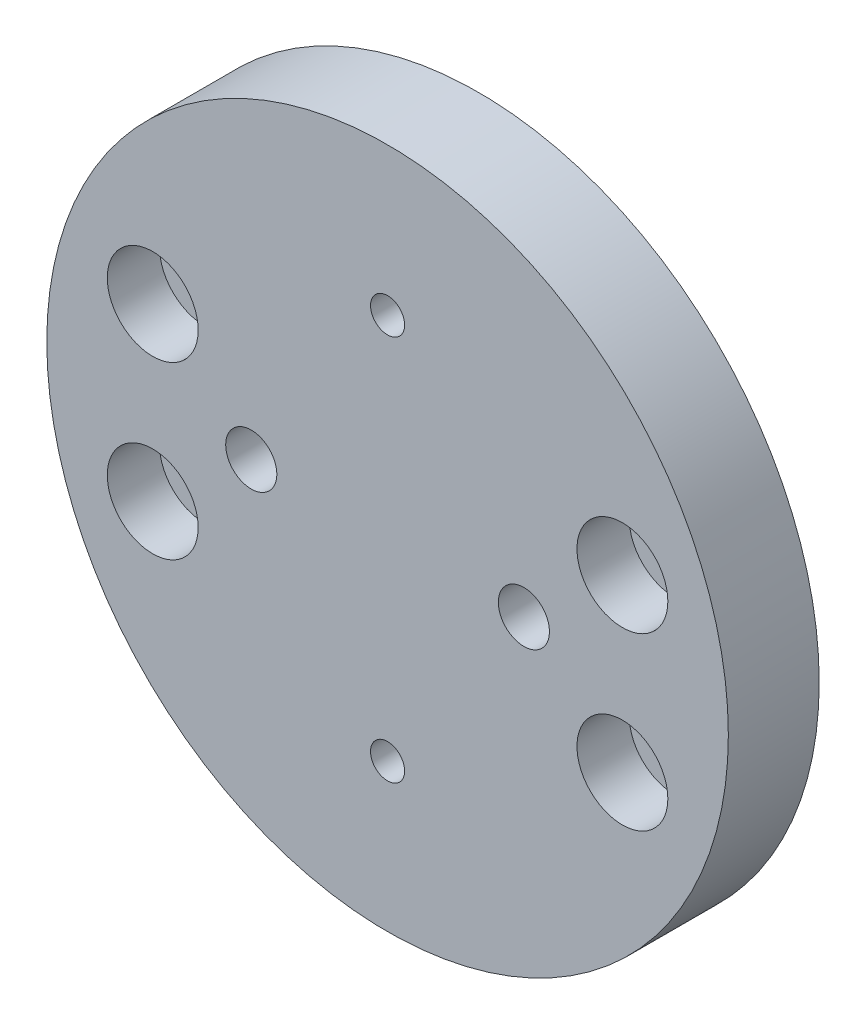
ISO-10303-21;
HEADER;
FILE_DESCRIPTION(('STEP AP214'),'2;1');
FILE_NAME('part.step','',(''),(''),'','','');
FILE_SCHEMA(('AUTOMOTIVE_DESIGN { 1 0 10303 214 1 1 1 1 }'));
ENDSEC;
DATA;
#1=APPLICATION_CONTEXT('core data for automotive mechanical design processes');
#2=APPLICATION_PROTOCOL_DEFINITION('international standard','automotive_design',2000,#1);
#3=PRODUCT_CONTEXT('',#1,'mechanical');
#4=PRODUCT('Part','Part','',(#3));
#5=PRODUCT_RELATED_PRODUCT_CATEGORY('part','',(#4));
#6=PRODUCT_DEFINITION_FORMATION('','',#4);
#7=PRODUCT_DEFINITION_CONTEXT('part definition',#1,'design');
#8=PRODUCT_DEFINITION('design','',#6,#7);
#9=PRODUCT_DEFINITION_SHAPE('','',#8);
#10=(LENGTH_UNIT() NAMED_UNIT(*) SI_UNIT(.MILLI.,.METRE.));
#11=(NAMED_UNIT(*) PLANE_ANGLE_UNIT() SI_UNIT($,.RADIAN.));
#12=(NAMED_UNIT(*) SI_UNIT($,.STERADIAN.) SOLID_ANGLE_UNIT());
#13=UNCERTAINTY_MEASURE_WITH_UNIT(LENGTH_MEASURE(1.E-05),#10,'distance_accuracy_value','');
#14=(GEOMETRIC_REPRESENTATION_CONTEXT(3) GLOBAL_UNCERTAINTY_ASSIGNED_CONTEXT((#13)) GLOBAL_UNIT_ASSIGNED_CONTEXT((#10,
#11,#12)) REPRESENTATION_CONTEXT('',''));
#15=CARTESIAN_POINT('',(0.,0.,0.));
#16=DIRECTION('',(0.,0.,1.));
#17=DIRECTION('',(1.,0.,0.));
#18=AXIS2_PLACEMENT_3D('',#15,#16,#17);
#19=CARTESIAN_POINT('',(0.,0.,8.));
#20=DIRECTION('',(0.,0.,-1.));
#21=DIRECTION('',(-1.,0.,0.));
#22=AXIS2_PLACEMENT_3D('',#19,#20,#21);
#23=CYLINDRICAL_SURFACE('',#22,30.);
#24=CARTESIAN_POINT('',(0.,0.,8.));
#25=DIRECTION('',(0.,0.,1.));
#26=DIRECTION('',(1.,0.,0.));
#27=AXIS2_PLACEMENT_3D('',#24,#25,#26);
#28=CIRCLE('',#27,30.);
#29=CARTESIAN_POINT('',(30.,0.,8.));
#30=VERTEX_POINT('',#29);
#31=EDGE_CURVE('E10',#30,#30,#28,.T.);
#32=ORIENTED_EDGE('',*,*,#31,.F.);
#33=EDGE_LOOP('',(#32));
#34=FACE_BOUND('',#33,.T.);
#35=CARTESIAN_POINT('',(0.,0.,0.));
#36=DIRECTION('',(0.,0.,1.));
#37=DIRECTION('',(1.,0.,0.));
#38=AXIS2_PLACEMENT_3D('',#35,#36,#37);
#39=CIRCLE('',#38,30.);
#40=CARTESIAN_POINT('',(30.,0.,0.));
#41=VERTEX_POINT('',#40);
#42=EDGE_CURVE('E36',#41,#41,#39,.T.);
#43=ORIENTED_EDGE('',*,*,#42,.T.);
#44=EDGE_LOOP('',(#43));
#45=FACE_BOUND('',#44,.T.);
#46=ADVANCED_FACE('F33',(#34,#45),#23,.T.);
#47=CARTESIAN_POINT('',(0.,0.,8.));
#48=DIRECTION('',(0.,0.,1.));
#49=DIRECTION('',(1.,0.,0.));
#50=AXIS2_PLACEMENT_3D('',#47,#48,#49);
#51=PLANE('',#50);
#52=CARTESIAN_POINT('',(-20.67323765729,7.52444315316473,8.));
#53=DIRECTION('',(0.,0.,1.));
#54=DIRECTION('',(1.,0.,0.));
#55=AXIS2_PLACEMENT_3D('',#52,#53,#54);
#56=CIRCLE('',#55,4.);
#57=CARTESIAN_POINT('',(-16.67323765729,7.52444315316473,8.));
#58=VERTEX_POINT('',#57);
#59=EDGE_CURVE('E131',#58,#58,#56,.T.);
#60=ORIENTED_EDGE('',*,*,#59,.F.);
#61=EDGE_LOOP('',(#60));
#62=FACE_BOUND('',#61,.T.);
#63=CARTESIAN_POINT('',(-20.67323765729,-7.52444315316473,8.));
#64=DIRECTION('',(0.,0.,1.));
#65=DIRECTION('',(1.,0.,0.));
#66=AXIS2_PLACEMENT_3D('',#63,#64,#65);
#67=CIRCLE('',#66,4.);
#68=CARTESIAN_POINT('',(-16.67323765729,-7.52444315316473,8.));
#69=VERTEX_POINT('',#68);
#70=EDGE_CURVE('E119',#69,#69,#67,.T.);
#71=ORIENTED_EDGE('',*,*,#70,.F.);
#72=EDGE_LOOP('',(#71));
#73=FACE_BOUND('',#72,.T.);
#74=CARTESIAN_POINT('',(20.67323765729,7.52444315316473,8.));
#75=DIRECTION('',(0.,0.,1.));
#76=DIRECTION('',(1.,0.,0.));
#77=AXIS2_PLACEMENT_3D('',#74,#75,#76);
#78=CIRCLE('',#77,4.);
#79=CARTESIAN_POINT('',(24.67323765729,7.52444315316473,8.));
#80=VERTEX_POINT('',#79);
#81=EDGE_CURVE('E107',#80,#80,#78,.T.);
#82=ORIENTED_EDGE('',*,*,#81,.F.);
#83=EDGE_LOOP('',(#82));
#84=FACE_BOUND('',#83,.T.);
#85=CARTESIAN_POINT('',(20.67323765729,-7.52444315316473,8.));
#86=DIRECTION('',(0.,0.,1.));
#87=DIRECTION('',(1.,0.,0.));
#88=AXIS2_PLACEMENT_3D('',#85,#86,#87);
#89=CIRCLE('',#88,4.);
#90=CARTESIAN_POINT('',(24.67323765729,-7.52444315316473,8.));
#91=VERTEX_POINT('',#90);
#92=EDGE_CURVE('E95',#91,#91,#89,.T.);
#93=ORIENTED_EDGE('',*,*,#92,.F.);
#94=EDGE_LOOP('',(#93));
#95=FACE_BOUND('',#94,.T.);
#96=CARTESIAN_POINT('',(0.,-17.,8.));
#97=DIRECTION('',(0.,0.,-1.));
#98=DIRECTION('',(-1.,0.,0.));
#99=AXIS2_PLACEMENT_3D('',#96,#97,#98);
#100=CIRCLE('',#99,1.5);
#101=CARTESIAN_POINT('',(-1.5,-17.,8.));
#102=VERTEX_POINT('',#101);
#103=EDGE_CURVE('E80',#102,#102,#100,.T.);
#104=ORIENTED_EDGE('',*,*,#103,.T.);
#105=EDGE_LOOP('',(#104));
#106=FACE_BOUND('',#105,.T.);
#107=CARTESIAN_POINT('',(0.,17.,8.));
#108=DIRECTION('',(0.,0.,-1.));
#109=DIRECTION('',(-1.,0.,0.));
#110=AXIS2_PLACEMENT_3D('',#107,#108,#109);
#111=CIRCLE('',#110,1.5);
#112=CARTESIAN_POINT('',(-1.5,17.,8.));
#113=VERTEX_POINT('',#112);
#114=EDGE_CURVE('E74',#113,#113,#111,.T.);
#115=ORIENTED_EDGE('',*,*,#114,.T.);
#116=EDGE_LOOP('',(#115));
#117=FACE_BOUND('',#116,.T.);
#118=CARTESIAN_POINT('',(12.,0.,8.));
#119=DIRECTION('',(0.,0.,-1.));
#120=DIRECTION('',(-1.,0.,0.));
#121=AXIS2_PLACEMENT_3D('',#118,#119,#120);
#122=CIRCLE('',#121,2.25);
#123=CARTESIAN_POINT('',(9.75,0.,8.));
#124=VERTEX_POINT('',#123);
#125=EDGE_CURVE('E59',#124,#124,#122,.T.);
#126=ORIENTED_EDGE('',*,*,#125,.T.);
#127=EDGE_LOOP('',(#126));
#128=FACE_BOUND('',#127,.T.);
#129=CARTESIAN_POINT('',(-12.,0.,8.));
#130=DIRECTION('',(0.,0.,-1.));
#131=DIRECTION('',(-1.,0.,0.));
#132=AXIS2_PLACEMENT_3D('',#129,#130,#131);
#133=CIRCLE('',#132,2.25);
#134=CARTESIAN_POINT('',(-14.25,0.,8.));
#135=VERTEX_POINT('',#134);
#136=EDGE_CURVE('E43',#135,#135,#133,.T.);
#137=ORIENTED_EDGE('',*,*,#136,.T.);
#138=EDGE_LOOP('',(#137));
#139=FACE_BOUND('',#138,.T.);
#140=ORIENTED_EDGE('',*,*,#31,.T.);
#141=EDGE_LOOP('',(#140));
#142=FACE_BOUND('',#141,.T.);
#143=ADVANCED_FACE('F137',(#62,#73,#84,#95,#106,#117,#128,#139,#142),#51,.T.);
#144=CARTESIAN_POINT('',(0.,0.,0.));
#145=DIRECTION('',(0.,0.,1.));
#146=DIRECTION('',(1.,0.,0.));
#147=AXIS2_PLACEMENT_3D('',#144,#145,#146);
#148=PLANE('',#147);
#149=CARTESIAN_POINT('',(-20.67323765729,7.52444315316473,0.));
#150=DIRECTION('',(0.,0.,1.));
#151=DIRECTION('',(1.,0.,0.));
#152=AXIS2_PLACEMENT_3D('',#149,#150,#151);
#153=CIRCLE('',#152,2.25);
#154=CARTESIAN_POINT('',(-18.42323765729,7.52444315316473,0.));
#155=VERTEX_POINT('',#154);
#156=EDGE_CURVE('E122',#155,#155,#153,.T.);
#157=ORIENTED_EDGE('',*,*,#156,.T.);
#158=EDGE_LOOP('',(#157));
#159=FACE_BOUND('',#158,.T.);
#160=CARTESIAN_POINT('',(-20.67323765729,-7.52444315316473,0.));
#161=DIRECTION('',(0.,0.,1.));
#162=DIRECTION('',(1.,0.,0.));
#163=AXIS2_PLACEMENT_3D('',#160,#161,#162);
#164=CIRCLE('',#163,2.25);
#165=CARTESIAN_POINT('',(-18.42323765729,-7.52444315316473,0.));
#166=VERTEX_POINT('',#165);
#167=EDGE_CURVE('E110',#166,#166,#164,.T.);
#168=ORIENTED_EDGE('',*,*,#167,.T.);
#169=EDGE_LOOP('',(#168));
#170=FACE_BOUND('',#169,.T.);
#171=CARTESIAN_POINT('',(20.67323765729,7.52444315316473,0.));
#172=DIRECTION('',(0.,0.,1.));
#173=DIRECTION('',(1.,0.,0.));
#174=AXIS2_PLACEMENT_3D('',#171,#172,#173);
#175=CIRCLE('',#174,2.25);
#176=CARTESIAN_POINT('',(22.92323765729,7.52444315316473,0.));
#177=VERTEX_POINT('',#176);
#178=EDGE_CURVE('E98',#177,#177,#175,.T.);
#179=ORIENTED_EDGE('',*,*,#178,.T.);
#180=EDGE_LOOP('',(#179));
#181=FACE_BOUND('',#180,.T.);
#182=CARTESIAN_POINT('',(20.67323765729,-7.52444315316473,0.));
#183=DIRECTION('',(0.,0.,1.));
#184=DIRECTION('',(1.,0.,0.));
#185=AXIS2_PLACEMENT_3D('',#182,#183,#184);
#186=CIRCLE('',#185,2.25);
#187=CARTESIAN_POINT('',(22.92323765729,-7.52444315316473,0.));
#188=VERTEX_POINT('',#187);
#189=EDGE_CURVE('E86',#188,#188,#186,.T.);
#190=ORIENTED_EDGE('',*,*,#189,.T.);
#191=EDGE_LOOP('',(#190));
#192=FACE_BOUND('',#191,.T.);
#193=CARTESIAN_POINT('',(0.,-17.,0.));
#194=DIRECTION('',(0.,0.,-1.));
#195=DIRECTION('',(-1.,0.,0.));
#196=AXIS2_PLACEMENT_3D('',#193,#194,#195);
#197=CIRCLE('',#196,1.49999999999999);
#198=CARTESIAN_POINT('',(-1.49999999999999,-17.,0.));
#199=VERTEX_POINT('',#198);
#200=EDGE_CURVE('E83',#199,#199,#197,.T.);
#201=ORIENTED_EDGE('',*,*,#200,.F.);
#202=EDGE_LOOP('',(#201));
#203=FACE_BOUND('',#202,.T.);
#204=CARTESIAN_POINT('',(0.,17.,0.));
#205=DIRECTION('',(0.,0.,-1.));
#206=DIRECTION('',(-1.,0.,0.));
#207=AXIS2_PLACEMENT_3D('',#204,#205,#206);
#208=CIRCLE('',#207,1.49999999999999);
#209=CARTESIAN_POINT('',(-1.49999999999999,17.,0.));
#210=VERTEX_POINT('',#209);
#211=EDGE_CURVE('E77',#210,#210,#208,.T.);
#212=ORIENTED_EDGE('',*,*,#211,.F.);
#213=EDGE_LOOP('',(#212));
#214=FACE_BOUND('',#213,.T.);
#215=CARTESIAN_POINT('',(12.,0.,0.));
#216=DIRECTION('',(0.,0.,-1.));
#217=DIRECTION('',(-1.,0.,0.));
#218=AXIS2_PLACEMENT_3D('',#215,#216,#217);
#219=CIRCLE('',#218,4.025);
#220=CARTESIAN_POINT('',(7.975,0.,0.));
#221=VERTEX_POINT('',#220);
#222=EDGE_CURVE('E71',#221,#221,#219,.T.);
#223=ORIENTED_EDGE('',*,*,#222,.F.);
#224=EDGE_LOOP('',(#223));
#225=FACE_BOUND('',#224,.T.);
#226=CARTESIAN_POINT('',(-12.,0.,0.));
#227=DIRECTION('',(0.,0.,-1.));
#228=DIRECTION('',(-1.,0.,0.));
#229=AXIS2_PLACEMENT_3D('',#226,#227,#228);
#230=CIRCLE('',#229,4.025);
#231=CARTESIAN_POINT('',(-16.025,0.,0.));
#232=VERTEX_POINT('',#231);
#233=EDGE_CURVE('E56',#232,#232,#230,.T.);
#234=ORIENTED_EDGE('',*,*,#233,.F.);
#235=EDGE_LOOP('',(#234));
#236=FACE_BOUND('',#235,.T.);
#237=ORIENTED_EDGE('',*,*,#42,.F.);
#238=EDGE_LOOP('',(#237));
#239=FACE_BOUND('',#238,.T.);
#240=ADVANCED_FACE('F140',(#159,#170,#181,#192,#203,#214,#225,#236,#239),#148,.F.);
#241=CARTESIAN_POINT('',(-12.,0.,0.));
#242=DIRECTION('',(0.,0.,-1.));
#243=DIRECTION('',(-1.,0.,0.));
#244=AXIS2_PLACEMENT_3D('',#241,#242,#243);
#245=CYLINDRICAL_SURFACE('',#244,2.25);
#246=ORIENTED_EDGE('',*,*,#136,.F.);
#247=EDGE_LOOP('',(#246));
#248=FACE_BOUND('',#247,.T.);
#249=CARTESIAN_POINT('',(-12.,0.,4.6));
#250=DIRECTION('',(0.,0.,-1.));
#251=DIRECTION('',(-1.,0.,0.));
#252=AXIS2_PLACEMENT_3D('',#249,#250,#251);
#253=CIRCLE('',#252,2.25);
#254=CARTESIAN_POINT('',(-14.25,0.,4.6));
#255=VERTEX_POINT('',#254);
#256=EDGE_CURVE('E47',#255,#255,#253,.T.);
#257=ORIENTED_EDGE('',*,*,#256,.T.);
#258=EDGE_LOOP('',(#257));
#259=FACE_BOUND('',#258,.T.);
#260=ADVANCED_FACE('F156',(#248,#259),#245,.F.);
#261=CARTESIAN_POINT('',(-8.00000000000001,0.,4.6));
#262=DIRECTION('',(0.,0.,1.));
#263=DIRECTION('',(1.,0.,0.));
#264=AXIS2_PLACEMENT_3D('',#261,#262,#263);
#265=PLANE('',#264);
#266=ORIENTED_EDGE('',*,*,#256,.F.);
#267=EDGE_LOOP('',(#266));
#268=FACE_BOUND('',#267,.T.);
#269=CARTESIAN_POINT('',(-12.,0.,4.6));
#270=DIRECTION('',(0.,0.,-1.));
#271=DIRECTION('',(-1.,0.,0.));
#272=AXIS2_PLACEMENT_3D('',#269,#270,#271);
#273=CIRCLE('',#272,4.);
#274=CARTESIAN_POINT('',(-16.,0.,4.6));
#275=VERTEX_POINT('',#274);
#276=EDGE_CURVE('E50',#275,#275,#273,.T.);
#277=ORIENTED_EDGE('',*,*,#276,.T.);
#278=EDGE_LOOP('',(#277));
#279=FACE_BOUND('',#278,.T.);
#280=ADVANCED_FACE('F159',(#268,#279),#265,.F.);
#281=CARTESIAN_POINT('',(-12.,0.,0.));
#282=DIRECTION('',(0.,0.,-1.));
#283=DIRECTION('',(-1.,0.,0.));
#284=AXIS2_PLACEMENT_3D('',#281,#282,#283);
#285=CYLINDRICAL_SURFACE('',#284,4.);
#286=ORIENTED_EDGE('',*,*,#276,.F.);
#287=EDGE_LOOP('',(#286));
#288=FACE_BOUND('',#287,.T.);
#289=CARTESIAN_POINT('',(-12.,0.,0.0250000000000027));
#290=DIRECTION('',(0.,0.,-1.));
#291=DIRECTION('',(-1.,0.,0.));
#292=AXIS2_PLACEMENT_3D('',#289,#290,#291);
#293=CIRCLE('',#292,4.);
#294=CARTESIAN_POINT('',(-16.,0.,0.0250000000000027));
#295=VERTEX_POINT('',#294);
#296=EDGE_CURVE('E53',#295,#295,#293,.T.);
#297=ORIENTED_EDGE('',*,*,#296,.T.);
#298=EDGE_LOOP('',(#297));
#299=FACE_BOUND('',#298,.T.);
#300=ADVANCED_FACE('F165',(#288,#299),#285,.F.);
#301=CARTESIAN_POINT('',(-12.,0.,0.));
#302=DIRECTION('',(0.,0.,-1.));
#303=DIRECTION('',(-1.,0.,0.));
#304=AXIS2_PLACEMENT_3D('',#301,#302,#303);
#305=CONICAL_SURFACE('',#304,4.025,0.785398163397444);
#306=ORIENTED_EDGE('',*,*,#296,.F.);
#307=EDGE_LOOP('',(#306));
#308=FACE_BOUND('',#307,.T.);
#309=ORIENTED_EDGE('',*,*,#233,.T.);
#310=EDGE_LOOP('',(#309));
#311=FACE_BOUND('',#310,.T.);
#312=ADVANCED_FACE('F171',(#308,#311),#305,.F.);
#313=CARTESIAN_POINT('',(12.,0.,0.));
#314=DIRECTION('',(0.,0.,-1.));
#315=DIRECTION('',(-1.,0.,0.));
#316=AXIS2_PLACEMENT_3D('',#313,#314,#315);
#317=CYLINDRICAL_SURFACE('',#316,2.25);
#318=ORIENTED_EDGE('',*,*,#125,.F.);
#319=EDGE_LOOP('',(#318));
#320=FACE_BOUND('',#319,.T.);
#321=CARTESIAN_POINT('',(12.,0.,4.6));
#322=DIRECTION('',(0.,0.,-1.));
#323=DIRECTION('',(-1.,0.,0.));
#324=AXIS2_PLACEMENT_3D('',#321,#322,#323);
#325=CIRCLE('',#324,2.25);
#326=CARTESIAN_POINT('',(9.75,0.,4.6));
#327=VERTEX_POINT('',#326);
#328=EDGE_CURVE('E62',#327,#327,#325,.T.);
#329=ORIENTED_EDGE('',*,*,#328,.T.);
#330=EDGE_LOOP('',(#329));
#331=FACE_BOUND('',#330,.T.);
#332=ADVANCED_FACE('F177',(#320,#331),#317,.F.);
#333=CARTESIAN_POINT('',(16.,0.,4.6));
#334=DIRECTION('',(0.,0.,1.));
#335=DIRECTION('',(1.,0.,0.));
#336=AXIS2_PLACEMENT_3D('',#333,#334,#335);
#337=PLANE('',#336);
#338=ORIENTED_EDGE('',*,*,#328,.F.);
#339=EDGE_LOOP('',(#338));
#340=FACE_BOUND('',#339,.T.);
#341=CARTESIAN_POINT('',(12.,0.,4.6));
#342=DIRECTION('',(0.,0.,-1.));
#343=DIRECTION('',(-1.,0.,0.));
#344=AXIS2_PLACEMENT_3D('',#341,#342,#343);
#345=CIRCLE('',#344,4.);
#346=CARTESIAN_POINT('',(8.,0.,4.6));
#347=VERTEX_POINT('',#346);
#348=EDGE_CURVE('E65',#347,#347,#345,.T.);
#349=ORIENTED_EDGE('',*,*,#348,.T.);
#350=EDGE_LOOP('',(#349));
#351=FACE_BOUND('',#350,.T.);
#352=ADVANCED_FACE('F222',(#340,#351),#337,.F.);
#353=CARTESIAN_POINT('',(12.,0.,0.));
#354=DIRECTION('',(0.,0.,-1.));
#355=DIRECTION('',(-1.,0.,0.));
#356=AXIS2_PLACEMENT_3D('',#353,#354,#355);
#357=CYLINDRICAL_SURFACE('',#356,4.);
#358=ORIENTED_EDGE('',*,*,#348,.F.);
#359=EDGE_LOOP('',(#358));
#360=FACE_BOUND('',#359,.T.);
#361=CARTESIAN_POINT('',(12.,0.,0.0250000000000027));
#362=DIRECTION('',(0.,0.,-1.));
#363=DIRECTION('',(-1.,0.,0.));
#364=AXIS2_PLACEMENT_3D('',#361,#362,#363);
#365=CIRCLE('',#364,4.);
#366=CARTESIAN_POINT('',(8.,0.,0.0250000000000027));
#367=VERTEX_POINT('',#366);
#368=EDGE_CURVE('E68',#367,#367,#365,.T.);
#369=ORIENTED_EDGE('',*,*,#368,.T.);
#370=EDGE_LOOP('',(#369));
#371=FACE_BOUND('',#370,.T.);
#372=ADVANCED_FACE('F230',(#360,#371),#357,.F.);
#373=CARTESIAN_POINT('',(12.,0.,0.));
#374=DIRECTION('',(0.,0.,-1.));
#375=DIRECTION('',(-1.,0.,0.));
#376=AXIS2_PLACEMENT_3D('',#373,#374,#375);
#377=CONICAL_SURFACE('',#376,4.025,0.785398163397409);
#378=ORIENTED_EDGE('',*,*,#368,.F.);
#379=EDGE_LOOP('',(#378));
#380=FACE_BOUND('',#379,.T.);
#381=ORIENTED_EDGE('',*,*,#222,.T.);
#382=EDGE_LOOP('',(#381));
#383=FACE_BOUND('',#382,.T.);
#384=ADVANCED_FACE('F238',(#380,#383),#377,.F.);
#385=CARTESIAN_POINT('',(0.,17.,0.));
#386=DIRECTION('',(0.,0.,-1.));
#387=DIRECTION('',(-1.,0.,0.));
#388=AXIS2_PLACEMENT_3D('',#385,#386,#387);
#389=CYLINDRICAL_SURFACE('',#388,1.49999999999999);
#390=ORIENTED_EDGE('',*,*,#114,.F.);
#391=EDGE_LOOP('',(#390));
#392=FACE_BOUND('',#391,.T.);
#393=ORIENTED_EDGE('',*,*,#211,.T.);
#394=EDGE_LOOP('',(#393));
#395=FACE_BOUND('',#394,.T.);
#396=ADVANCED_FACE('F246',(#392,#395),#389,.F.);
#397=CARTESIAN_POINT('',(0.,-17.,0.));
#398=DIRECTION('',(0.,0.,-1.));
#399=DIRECTION('',(-1.,0.,0.));
#400=AXIS2_PLACEMENT_3D('',#397,#398,#399);
#401=CYLINDRICAL_SURFACE('',#400,1.49999999999999);
#402=ORIENTED_EDGE('',*,*,#103,.F.);
#403=EDGE_LOOP('',(#402));
#404=FACE_BOUND('',#403,.T.);
#405=ORIENTED_EDGE('',*,*,#200,.T.);
#406=EDGE_LOOP('',(#405));
#407=FACE_BOUND('',#406,.T.);
#408=ADVANCED_FACE('F254',(#404,#407),#401,.F.);
#409=CARTESIAN_POINT('',(20.67323765729,-7.52444315316473,8.));
#410=DIRECTION('',(0.,0.,1.));
#411=DIRECTION('',(1.,0.,0.));
#412=AXIS2_PLACEMENT_3D('',#409,#410,#411);
#413=CYLINDRICAL_SURFACE('',#412,2.25);
#414=ORIENTED_EDGE('',*,*,#189,.F.);
#415=EDGE_LOOP('',(#414));
#416=FACE_BOUND('',#415,.T.);
#417=CARTESIAN_POINT('',(20.67323765729,-7.52444315316473,3.4));
#418=DIRECTION('',(0.,0.,1.));
#419=DIRECTION('',(1.,0.,0.));
#420=AXIS2_PLACEMENT_3D('',#417,#418,#419);
#421=CIRCLE('',#420,2.25);
#422=CARTESIAN_POINT('',(22.92323765729,-7.52444315316473,3.4));
#423=VERTEX_POINT('',#422);
#424=EDGE_CURVE('E89',#423,#423,#421,.T.);
#425=ORIENTED_EDGE('',*,*,#424,.T.);
#426=EDGE_LOOP('',(#425));
#427=FACE_BOUND('',#426,.T.);
#428=ADVANCED_FACE('F261',(#416,#427),#413,.F.);
#429=CARTESIAN_POINT('',(22.92323765729,-7.52444315316473,3.4));
#430=DIRECTION('',(0.,0.,-1.));
#431=DIRECTION('',(-1.,0.,0.));
#432=AXIS2_PLACEMENT_3D('',#429,#430,#431);
#433=PLANE('',#432);
#434=ORIENTED_EDGE('',*,*,#424,.F.);
#435=EDGE_LOOP('',(#434));
#436=FACE_BOUND('',#435,.T.);
#437=CARTESIAN_POINT('',(20.67323765729,-7.52444315316473,3.4));
#438=DIRECTION('',(0.,0.,1.));
#439=DIRECTION('',(1.,0.,0.));
#440=AXIS2_PLACEMENT_3D('',#437,#438,#439);
#441=CIRCLE('',#440,4.);
#442=CARTESIAN_POINT('',(24.67323765729,-7.52444315316473,3.4));
#443=VERTEX_POINT('',#442);
#444=EDGE_CURVE('E92',#443,#443,#441,.T.);
#445=ORIENTED_EDGE('',*,*,#444,.T.);
#446=EDGE_LOOP('',(#445));
#447=FACE_BOUND('',#446,.T.);
#448=ADVANCED_FACE('F268',(#436,#447),#433,.F.);
#449=CARTESIAN_POINT('',(20.67323765729,-7.52444315316473,8.));
#450=DIRECTION('',(0.,0.,1.));
#451=DIRECTION('',(1.,0.,0.));
#452=AXIS2_PLACEMENT_3D('',#449,#450,#451);
#453=CYLINDRICAL_SURFACE('',#452,4.);
#454=ORIENTED_EDGE('',*,*,#444,.F.);
#455=EDGE_LOOP('',(#454));
#456=FACE_BOUND('',#455,.T.);
#457=ORIENTED_EDGE('',*,*,#92,.T.);
#458=EDGE_LOOP('',(#457));
#459=FACE_BOUND('',#458,.T.);
#460=ADVANCED_FACE('F276',(#456,#459),#453,.F.);
#461=CARTESIAN_POINT('',(20.67323765729,7.52444315316473,8.));
#462=DIRECTION('',(0.,0.,1.));
#463=DIRECTION('',(1.,0.,0.));
#464=AXIS2_PLACEMENT_3D('',#461,#462,#463);
#465=CYLINDRICAL_SURFACE('',#464,2.25);
#466=ORIENTED_EDGE('',*,*,#178,.F.);
#467=EDGE_LOOP('',(#466));
#468=FACE_BOUND('',#467,.T.);
#469=CARTESIAN_POINT('',(20.67323765729,7.52444315316473,3.4));
#470=DIRECTION('',(0.,0.,1.));
#471=DIRECTION('',(1.,0.,0.));
#472=AXIS2_PLACEMENT_3D('',#469,#470,#471);
#473=CIRCLE('',#472,2.25);
#474=CARTESIAN_POINT('',(22.92323765729,7.52444315316473,3.4));
#475=VERTEX_POINT('',#474);
#476=EDGE_CURVE('E101',#475,#475,#473,.T.);
#477=ORIENTED_EDGE('',*,*,#476,.T.);
#478=EDGE_LOOP('',(#477));
#479=FACE_BOUND('',#478,.T.);
#480=ADVANCED_FACE('F284',(#468,#479),#465,.F.);
#481=CARTESIAN_POINT('',(22.92323765729,7.52444315316473,3.4));
#482=DIRECTION('',(0.,0.,-1.));
#483=DIRECTION('',(-1.,0.,0.));
#484=AXIS2_PLACEMENT_3D('',#481,#482,#483);
#485=PLANE('',#484);
#486=ORIENTED_EDGE('',*,*,#476,.F.);
#487=EDGE_LOOP('',(#486));
#488=FACE_BOUND('',#487,.T.);
#489=CARTESIAN_POINT('',(20.67323765729,7.52444315316473,3.4));
#490=DIRECTION('',(0.,0.,1.));
#491=DIRECTION('',(1.,0.,0.));
#492=AXIS2_PLACEMENT_3D('',#489,#490,#491);
#493=CIRCLE('',#492,4.);
#494=CARTESIAN_POINT('',(24.67323765729,7.52444315316473,3.4));
#495=VERTEX_POINT('',#494);
#496=EDGE_CURVE('E104',#495,#495,#493,.T.);
#497=ORIENTED_EDGE('',*,*,#496,.T.);
#498=EDGE_LOOP('',(#497));
#499=FACE_BOUND('',#498,.T.);
#500=ADVANCED_FACE('F292',(#488,#499),#485,.F.);
#501=CARTESIAN_POINT('',(20.67323765729,7.52444315316473,8.));
#502=DIRECTION('',(0.,0.,1.));
#503=DIRECTION('',(1.,0.,0.));
#504=AXIS2_PLACEMENT_3D('',#501,#502,#503);
#505=CYLINDRICAL_SURFACE('',#504,4.);
#506=ORIENTED_EDGE('',*,*,#496,.F.);
#507=EDGE_LOOP('',(#506));
#508=FACE_BOUND('',#507,.T.);
#509=ORIENTED_EDGE('',*,*,#81,.T.);
#510=EDGE_LOOP('',(#509));
#511=FACE_BOUND('',#510,.T.);
#512=ADVANCED_FACE('F300',(#508,#511),#505,.F.);
#513=CARTESIAN_POINT('',(-20.67323765729,-7.52444315316473,8.));
#514=DIRECTION('',(0.,0.,1.));
#515=DIRECTION('',(1.,0.,0.));
#516=AXIS2_PLACEMENT_3D('',#513,#514,#515);
#517=CYLINDRICAL_SURFACE('',#516,2.25);
#518=ORIENTED_EDGE('',*,*,#167,.F.);
#519=EDGE_LOOP('',(#518));
#520=FACE_BOUND('',#519,.T.);
#521=CARTESIAN_POINT('',(-20.67323765729,-7.52444315316473,3.4));
#522=DIRECTION('',(0.,0.,1.));
#523=DIRECTION('',(1.,0.,0.));
#524=AXIS2_PLACEMENT_3D('',#521,#522,#523);
#525=CIRCLE('',#524,2.25);
#526=CARTESIAN_POINT('',(-18.42323765729,-7.52444315316473,3.4));
#527=VERTEX_POINT('',#526);
#528=EDGE_CURVE('E113',#527,#527,#525,.T.);
#529=ORIENTED_EDGE('',*,*,#528,.T.);
#530=EDGE_LOOP('',(#529));
#531=FACE_BOUND('',#530,.T.);
#532=ADVANCED_FACE('F308',(#520,#531),#517,.F.);
#533=CARTESIAN_POINT('',(-18.42323765729,-7.52444315316473,3.4));
#534=DIRECTION('',(0.,0.,-1.));
#535=DIRECTION('',(-1.,0.,0.));
#536=AXIS2_PLACEMENT_3D('',#533,#534,#535);
#537=PLANE('',#536);
#538=ORIENTED_EDGE('',*,*,#528,.F.);
#539=EDGE_LOOP('',(#538));
#540=FACE_BOUND('',#539,.T.);
#541=CARTESIAN_POINT('',(-20.67323765729,-7.52444315316473,3.4));
#542=DIRECTION('',(0.,0.,1.));
#543=DIRECTION('',(1.,0.,0.));
#544=AXIS2_PLACEMENT_3D('',#541,#542,#543);
#545=CIRCLE('',#544,4.);
#546=CARTESIAN_POINT('',(-16.67323765729,-7.52444315316473,3.4));
#547=VERTEX_POINT('',#546);
#548=EDGE_CURVE('E116',#547,#547,#545,.T.);
#549=ORIENTED_EDGE('',*,*,#548,.T.);
#550=EDGE_LOOP('',(#549));
#551=FACE_BOUND('',#550,.T.);
#552=ADVANCED_FACE('F316',(#540,#551),#537,.F.);
#553=CARTESIAN_POINT('',(-20.67323765729,-7.52444315316473,8.));
#554=DIRECTION('',(0.,0.,1.));
#555=DIRECTION('',(1.,0.,0.));
#556=AXIS2_PLACEMENT_3D('',#553,#554,#555);
#557=CYLINDRICAL_SURFACE('',#556,4.);
#558=ORIENTED_EDGE('',*,*,#548,.F.);
#559=EDGE_LOOP('',(#558));
#560=FACE_BOUND('',#559,.T.);
#561=ORIENTED_EDGE('',*,*,#70,.T.);
#562=EDGE_LOOP('',(#561));
#563=FACE_BOUND('',#562,.T.);
#564=ADVANCED_FACE('F324',(#560,#563),#557,.F.);
#565=CARTESIAN_POINT('',(-20.67323765729,7.52444315316473,8.));
#566=DIRECTION('',(0.,0.,1.));
#567=DIRECTION('',(1.,0.,0.));
#568=AXIS2_PLACEMENT_3D('',#565,#566,#567);
#569=CYLINDRICAL_SURFACE('',#568,2.25);
#570=ORIENTED_EDGE('',*,*,#156,.F.);
#571=EDGE_LOOP('',(#570));
#572=FACE_BOUND('',#571,.T.);
#573=CARTESIAN_POINT('',(-20.67323765729,7.52444315316473,3.4));
#574=DIRECTION('',(0.,0.,1.));
#575=DIRECTION('',(1.,0.,0.));
#576=AXIS2_PLACEMENT_3D('',#573,#574,#575);
#577=CIRCLE('',#576,2.25);
#578=CARTESIAN_POINT('',(-18.42323765729,7.52444315316473,3.4));
#579=VERTEX_POINT('',#578);
#580=EDGE_CURVE('E125',#579,#579,#577,.T.);
#581=ORIENTED_EDGE('',*,*,#580,.T.);
#582=EDGE_LOOP('',(#581));
#583=FACE_BOUND('',#582,.T.);
#584=ADVANCED_FACE('F332',(#572,#583),#569,.F.);
#585=CARTESIAN_POINT('',(-18.42323765729,7.52444315316473,3.4));
#586=DIRECTION('',(0.,0.,-1.));
#587=DIRECTION('',(-1.,0.,0.));
#588=AXIS2_PLACEMENT_3D('',#585,#586,#587);
#589=PLANE('',#588);
#590=ORIENTED_EDGE('',*,*,#580,.F.);
#591=EDGE_LOOP('',(#590));
#592=FACE_BOUND('',#591,.T.);
#593=CARTESIAN_POINT('',(-20.67323765729,7.52444315316473,3.4));
#594=DIRECTION('',(0.,0.,1.));
#595=DIRECTION('',(1.,0.,0.));
#596=AXIS2_PLACEMENT_3D('',#593,#594,#595);
#597=CIRCLE('',#596,4.);
#598=CARTESIAN_POINT('',(-16.67323765729,7.52444315316473,3.4));
#599=VERTEX_POINT('',#598);
#600=EDGE_CURVE('E128',#599,#599,#597,.T.);
#601=ORIENTED_EDGE('',*,*,#600,.T.);
#602=EDGE_LOOP('',(#601));
#603=FACE_BOUND('',#602,.T.);
#604=ADVANCED_FACE('F340',(#592,#603),#589,.F.);
#605=CARTESIAN_POINT('',(-20.67323765729,7.52444315316473,8.));
#606=DIRECTION('',(0.,0.,1.));
#607=DIRECTION('',(1.,0.,0.));
#608=AXIS2_PLACEMENT_3D('',#605,#606,#607);
#609=CYLINDRICAL_SURFACE('',#608,4.);
#610=ORIENTED_EDGE('',*,*,#600,.F.);
#611=EDGE_LOOP('',(#610));
#612=FACE_BOUND('',#611,.T.);
#613=ORIENTED_EDGE('',*,*,#59,.T.);
#614=EDGE_LOOP('',(#613));
#615=FACE_BOUND('',#614,.T.);
#616=ADVANCED_FACE('F135',(#612,#615),#609,.F.);
#617=CLOSED_SHELL('',(#46,#143,#240,#260,#280,#300,#312,#332,#352,#372,#384,#396,#408,#428,#448,
#460,#480,#500,#512,#532,#552,#564,#584,#604,#616));
#618=MANIFOLD_SOLID_BREP('B2',#617);
#619=ADVANCED_BREP_SHAPE_REPRESENTATION('',(#18,#618),#14);
#620=SHAPE_DEFINITION_REPRESENTATION(#9,#619);
ENDSEC;
END-ISO-10303-21;
